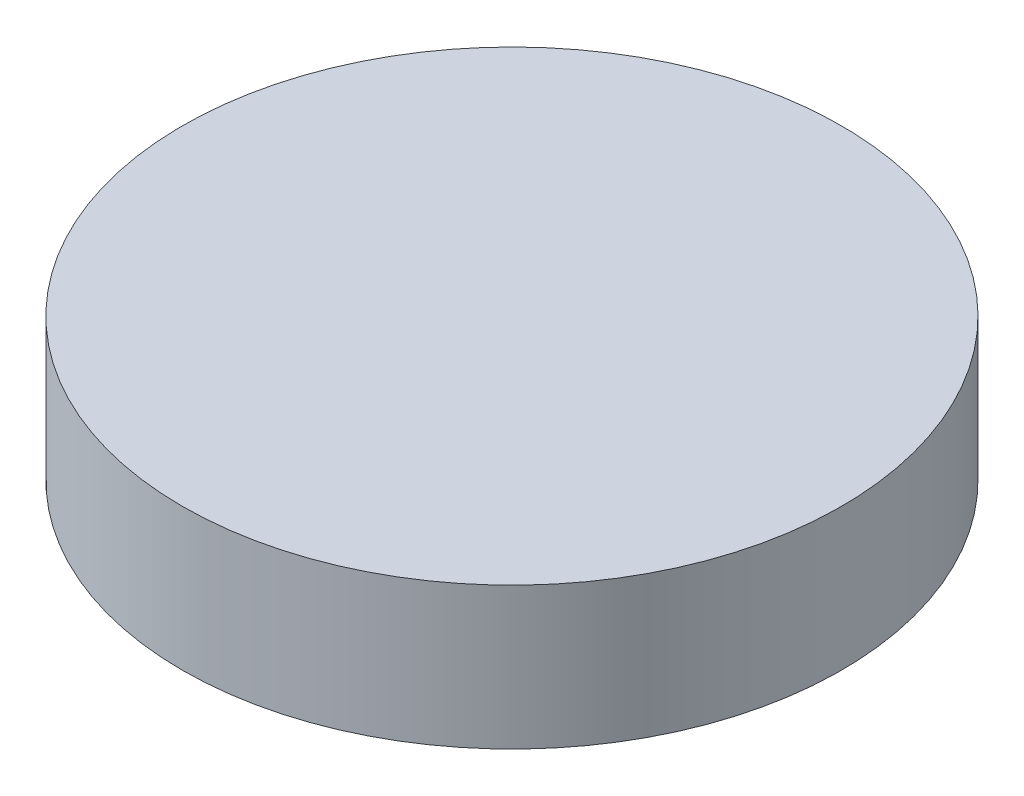
ISO-10303-21;
HEADER;
FILE_DESCRIPTION(('STEP AP214'),'2;1');
FILE_NAME('part.step','',(''),(''),'','','');
FILE_SCHEMA(('AUTOMOTIVE_DESIGN { 1 0 10303 214 1 1 1 1 }'));
ENDSEC;
DATA;
#1=APPLICATION_CONTEXT('core data for automotive mechanical design processes');
#2=APPLICATION_PROTOCOL_DEFINITION('international standard','automotive_design',2000,#1);
#3=PRODUCT_CONTEXT('',#1,'mechanical');
#4=PRODUCT('Part','Part','',(#3));
#5=PRODUCT_RELATED_PRODUCT_CATEGORY('part','',(#4));
#6=PRODUCT_DEFINITION_FORMATION('','',#4);
#7=PRODUCT_DEFINITION_CONTEXT('part definition',#1,'design');
#8=PRODUCT_DEFINITION('design','',#6,#7);
#9=PRODUCT_DEFINITION_SHAPE('','',#8);
#10=(LENGTH_UNIT() NAMED_UNIT(*) SI_UNIT(.MILLI.,.METRE.));
#11=(NAMED_UNIT(*) PLANE_ANGLE_UNIT() SI_UNIT($,.RADIAN.));
#12=(NAMED_UNIT(*) SI_UNIT($,.STERADIAN.) SOLID_ANGLE_UNIT());
#13=UNCERTAINTY_MEASURE_WITH_UNIT(LENGTH_MEASURE(1.E-05),#10,'distance_accuracy_value','');
#14=(GEOMETRIC_REPRESENTATION_CONTEXT(3) GLOBAL_UNCERTAINTY_ASSIGNED_CONTEXT((#13)) GLOBAL_UNIT_ASSIGNED_CONTEXT((#10,
#11,#12)) REPRESENTATION_CONTEXT('',''));
#15=CARTESIAN_POINT('',(0.,0.,0.));
#16=DIRECTION('',(0.,0.,1.));
#17=DIRECTION('',(1.,0.,0.));
#18=AXIS2_PLACEMENT_3D('',#15,#16,#17);
#19=CARTESIAN_POINT('',(0.,6.,0.));
#20=DIRECTION('',(0.,-1.,0.));
#21=DIRECTION('',(0.,0.,-1.));
#22=AXIS2_PLACEMENT_3D('',#19,#20,#21);
#23=CYLINDRICAL_SURFACE('',#22,13.93);
#24=CARTESIAN_POINT('',(0.,6.,0.));
#25=DIRECTION('',(0.,1.,0.));
#26=DIRECTION('',(0.,0.,1.));
#27=AXIS2_PLACEMENT_3D('',#24,#25,#26);
#28=CIRCLE('',#27,13.93);
#29=CARTESIAN_POINT('',(0.,6.,13.93));
#30=VERTEX_POINT('',#29);
#31=EDGE_CURVE('E10',#30,#30,#28,.T.);
#32=ORIENTED_EDGE('',*,*,#31,.F.);
#33=EDGE_LOOP('',(#32));
#34=FACE_BOUND('',#33,.T.);
#35=CARTESIAN_POINT('',(0.,0.,0.));
#36=DIRECTION('',(0.,1.,0.));
#37=DIRECTION('',(0.,0.,1.));
#38=AXIS2_PLACEMENT_3D('',#35,#36,#37);
#39=CIRCLE('',#38,13.93);
#40=CARTESIAN_POINT('',(0.,0.,13.93));
#41=VERTEX_POINT('',#40);
#42=EDGE_CURVE('E34',#41,#41,#39,.T.);
#43=ORIENTED_EDGE('',*,*,#42,.T.);
#44=EDGE_LOOP('',(#43));
#45=FACE_BOUND('',#44,.T.);
#46=ADVANCED_FACE('F31',(#34,#45),#23,.T.);
#47=CARTESIAN_POINT('',(0.,6.,0.));
#48=DIRECTION('',(0.,1.,0.));
#49=DIRECTION('',(0.,0.,1.));
#50=AXIS2_PLACEMENT_3D('',#47,#48,#49);
#51=PLANE('',#50);
#52=ORIENTED_EDGE('',*,*,#31,.T.);
#53=EDGE_LOOP('',(#52));
#54=FACE_BOUND('',#53,.T.);
#55=ADVANCED_FACE('F46',(#54),#51,.T.);
#56=CARTESIAN_POINT('',(0.,0.,0.));
#57=DIRECTION('',(0.,1.,0.));
#58=DIRECTION('',(0.,0.,1.));
#59=AXIS2_PLACEMENT_3D('',#56,#57,#58);
#60=PLANE('',#59);
#61=ORIENTED_EDGE('',*,*,#42,.F.);
#62=EDGE_LOOP('',(#61));
#63=FACE_BOUND('',#62,.T.);
#64=ADVANCED_FACE('F44',(#63),#60,.F.);
#65=CLOSED_SHELL('',(#46,#55,#64));
#66=MANIFOLD_SOLID_BREP('B2',#65);
#67=ADVANCED_BREP_SHAPE_REPRESENTATION('',(#18,#66),#14);
#68=SHAPE_DEFINITION_REPRESENTATION(#9,#67);
ENDSEC;
END-ISO-10303-21;
